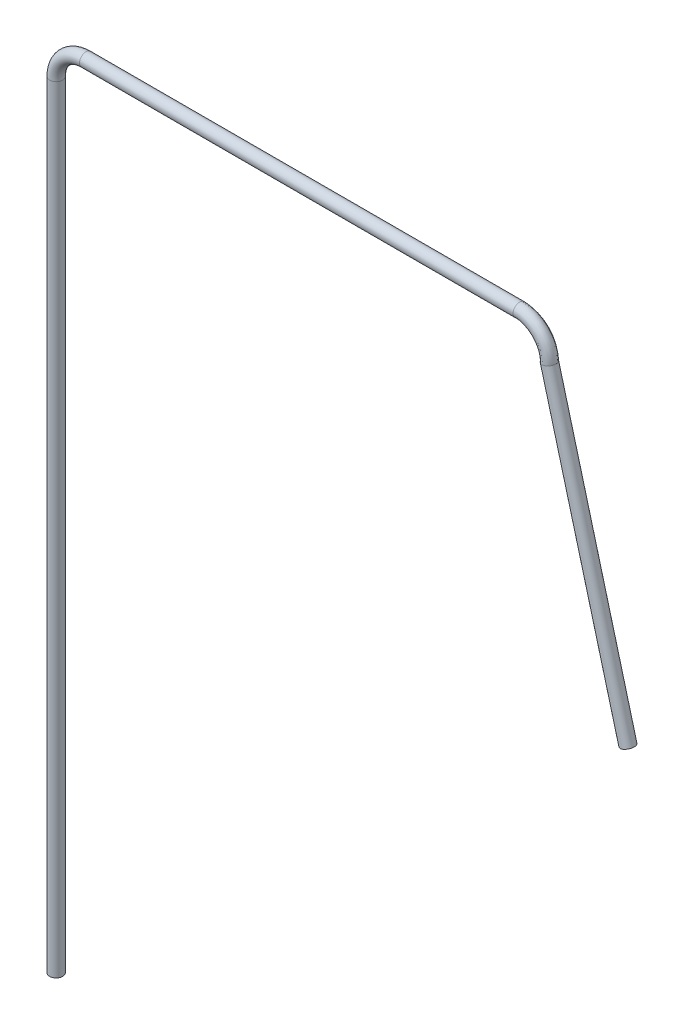
ISO-10303-21;
HEADER;
FILE_DESCRIPTION(('STEP AP214'),'2;1');
FILE_NAME('part.step','',(''),(''),'','','');
FILE_SCHEMA(('AUTOMOTIVE_DESIGN { 1 0 10303 214 1 1 1 1 }'));
ENDSEC;
DATA;
#1=APPLICATION_CONTEXT('core data for automotive mechanical design processes');
#2=APPLICATION_PROTOCOL_DEFINITION('international standard','automotive_design',2000,#1);
#3=PRODUCT_CONTEXT('',#1,'mechanical');
#4=PRODUCT('Part','Part','',(#3));
#5=PRODUCT_RELATED_PRODUCT_CATEGORY('part','',(#4));
#6=PRODUCT_DEFINITION_FORMATION('','',#4);
#7=PRODUCT_DEFINITION_CONTEXT('part definition',#1,'design');
#8=PRODUCT_DEFINITION('design','',#6,#7);
#9=PRODUCT_DEFINITION_SHAPE('','',#8);
#10=(LENGTH_UNIT() NAMED_UNIT(*) SI_UNIT(.MILLI.,.METRE.));
#11=(NAMED_UNIT(*) PLANE_ANGLE_UNIT() SI_UNIT($,.RADIAN.));
#12=(NAMED_UNIT(*) SI_UNIT($,.STERADIAN.) SOLID_ANGLE_UNIT());
#13=UNCERTAINTY_MEASURE_WITH_UNIT(LENGTH_MEASURE(1.E-05),#10,'distance_accuracy_value','');
#14=(GEOMETRIC_REPRESENTATION_CONTEXT(3) GLOBAL_UNCERTAINTY_ASSIGNED_CONTEXT((#13)) GLOBAL_UNIT_ASSIGNED_CONTEXT((#10,
#11,#12)) REPRESENTATION_CONTEXT('',''));
#15=CARTESIAN_POINT('',(0.,0.,0.));
#16=DIRECTION('',(0.,0.,1.));
#17=DIRECTION('',(1.,0.,0.));
#18=AXIS2_PLACEMENT_3D('',#15,#16,#17);
#19=CARTESIAN_POINT('',(71.0623231269298,-110.019219140882,0.));
#20=DIRECTION('',(-0.258819045102518,0.965925826289069,0.));
#21=DIRECTION('',(-0.965925826289069,-0.258819045102518,0.));
#22=AXIS2_PLACEMENT_3D('',#19,#20,#21);
#23=PLANE('',#22);
#24=CARTESIAN_POINT('',(71.0623231269298,-110.019219140882,0.));
#25=DIRECTION('',(-0.258819045102518,0.965925826289069,0.));
#26=DIRECTION('',(-0.965925826289069,-0.258819045102518,0.));
#27=AXIS2_PLACEMENT_3D('',#24,#25,#26);
#28=CIRCLE('',#27,3.81);
#29=CARTESIAN_POINT('',(67.3821457287685,-111.005319702722,0.));
#30=VERTEX_POINT('',#29);
#31=EDGE_CURVE('E60',#30,#30,#28,.T.);
#32=ORIENTED_EDGE('',*,*,#31,.F.);
#33=EDGE_LOOP('',(#32));
#34=FACE_BOUND('',#33,.T.);
#35=ADVANCED_FACE('F57',(#34),#23,.F.);
#36=CARTESIAN_POINT('',(-263.880572628289,-392.8701058306,0.));
#37=DIRECTION('',(0.,-1.,0.));
#38=DIRECTION('',(1.,0.,0.));
#39=AXIS2_PLACEMENT_3D('',#36,#37,#38);
#40=PLANE('',#39);
#41=CARTESIAN_POINT('',(-263.880572628289,-392.8701058306,0.));
#42=DIRECTION('',(0.,-1.,0.));
#43=DIRECTION('',(1.,0.,0.));
#44=AXIS2_PLACEMENT_3D('',#41,#42,#43);
#45=CIRCLE('',#44,3.81);
#46=CARTESIAN_POINT('',(-260.070572628289,-392.8701058306,0.));
#47=VERTEX_POINT('',#46);
#48=EDGE_CURVE('E134',#47,#47,#45,.T.);
#49=ORIENTED_EDGE('',*,*,#48,.T.);
#50=EDGE_LOOP('',(#49));
#51=FACE_BOUND('',#50,.T.);
#52=ADVANCED_FACE('F103',(#51),#40,.T.);
#53=CARTESIAN_POINT('',(24.8734767757891,62.35990218457,0.));
#54=DIRECTION('',(0.258819045102518,-0.965925826289069,0.));
#55=DIRECTION('',(0.965925826289069,0.258819045102518,0.));
#56=AXIS2_PLACEMENT_3D('',#53,#54,#55);
#57=CYLINDRICAL_SURFACE('',#56,3.81);
#58=CARTESIAN_POINT('',(25.0442969077021,61.7223927733147,-3.81000000000001));
#59=CARTESIAN_POINT('',(25.0522610892445,61.7234256772541,-3.81000003232664));
#60=CARTESIAN_POINT('',(25.0602255142462,61.724458985088,-3.80997508181354));
#61=CARTESIAN_POINT('',(25.1757193333071,61.7394485959842,-3.8092510848454));
#62=CARTESIAN_POINT('',(25.283260393004,61.7534738492406,-3.80402430168937));
#63=CARTESIAN_POINT('',(25.4975397663905,61.781554400173,-3.78449126548577));
#64=CARTESIAN_POINT('',(25.604277636522,61.7956097096297,-3.77018032179651));
#65=CARTESIAN_POINT('',(25.8164107398512,61.8236715487577,-3.73252114986992));
#66=CARTESIAN_POINT('',(25.9218025690519,61.8376779071298,-3.70915343848997));
#67=CARTESIAN_POINT('',(26.1302982509642,61.865504373381,-3.65353260963023));
#68=CARTESIAN_POINT('',(26.2334002790882,61.8793243295125,-3.62127266294687));
#69=CARTESIAN_POINT('',(26.5377169170544,61.9202743649971,-3.51158540434899));
#70=CARTESIAN_POINT('',(26.7344704732571,61.9469646573121,-3.4211564041722));
#71=CARTESIAN_POINT('',(27.109980123835,61.9982235349587,-3.20805164393777));
#72=CARTESIAN_POINT('',(27.2887361527676,62.0227921125754,-3.08537576663012));
#73=CARTESIAN_POINT('',(27.5390054763454,62.0573657333831,-2.88023072351548));
#74=CARTESIAN_POINT('',(27.6193345239919,62.0684940866937,-2.80846142230658));
#75=CARTESIAN_POINT('',(27.7736167717109,62.089918859367,-2.65836386191284));
#76=CARTESIAN_POINT('',(27.847576036798,62.1002160695056,-2.58004198509613));
#77=CARTESIAN_POINT('',(27.988667970607,62.1199028749767,-2.4173006642552));
#78=CARTESIAN_POINT('',(28.0557974074128,62.1292920405139,-2.33287836549267));
#79=CARTESIAN_POINT('',(28.1827017468923,62.1470766122553,-2.15858141604659));
#80=CARTESIAN_POINT('',(28.2424749936853,62.1554717946975,-2.06870554453513));
#81=CARTESIAN_POINT('',(28.4091678856227,62.1789245000401,-1.79329477469068));
#82=CARTESIAN_POINT('',(28.5047014310135,62.1924227387294,-1.60054177329632));
#83=CARTESIAN_POINT('',(28.6620696108415,62.2147072204423,-1.20160935562392));
#84=CARTESIAN_POINT('',(28.7239062398843,62.2234937423638,-0.995430734851183));
#85=CARTESIAN_POINT('',(28.8118602755316,62.2360023125349,-0.576773834235255));
#86=CARTESIAN_POINT('',(28.8382002672828,62.2397559194141,-0.364343427597758));
#87=CARTESIAN_POINT('',(28.8550853426785,62.2421616270996,0.0619550483770847));
#88=CARTESIAN_POINT('',(28.8456311641643,62.2408138330634,0.275823087989143));
#89=CARTESIAN_POINT('',(28.7912919084127,62.2330768351317,0.698304177726123));
#90=CARTESIAN_POINT('',(28.7465061850734,62.2267017681747,0.906930273472131));
#91=CARTESIAN_POINT('',(28.6229357515052,62.2091619185618,1.31364520872172));
#92=CARTESIAN_POINT('',(28.5441505634795,62.1979970685947,1.51173390009845));
#93=CARTESIAN_POINT('',(28.3547301602318,62.1712561854106,1.89209754634442));
#94=CARTESIAN_POINT('',(28.2440466590232,62.1556734652399,2.07434797760268));
#95=CARTESIAN_POINT('',(27.9940914569152,62.120644591131,2.41760765420608));
#96=CARTESIAN_POINT('',(27.854821811761,62.1011987150113,2.57861842561406));
#97=CARTESIAN_POINT('',(27.5508901102288,62.0589863851773,2.87576405303329));
#98=CARTESIAN_POINT('',(27.3861012450869,62.036203381195,3.01176682486794));
#99=CARTESIAN_POINT('',(27.036259900127,61.9881338264271,3.25422588031956));
#100=CARTESIAN_POINT('',(26.8511967743179,61.9628459610159,3.36066653620014));
#101=CARTESIAN_POINT('',(26.4631389398238,61.9102035688489,3.54244943311996));
#102=CARTESIAN_POINT('',(26.2599124419926,61.882823262024,3.6172888285367));
#103=CARTESIAN_POINT('',(25.8441605810055,61.8272978729213,3.73133359574699));
#104=CARTESIAN_POINT('',(25.6316546707728,61.7991544333721,3.77061008398302));
#105=CARTESIAN_POINT('',(25.301401269251,61.7558399598797,3.8031169568371));
#106=CARTESIAN_POINT('',(25.1848008632981,61.7406272437023,3.80919466993822));
#107=CARTESIAN_POINT('',(25.0602256374236,61.724459002313,3.80997504589845));
#108=CARTESIAN_POINT('',(25.0522612224854,61.7234256958681,3.80999999377994));
#109=CARTESIAN_POINT('',(25.0442969077022,61.7223927733147,3.81000000000002));
#110=B_SPLINE_CURVE_WITH_KNOTS('',3,(#58,#59,#60,#61,#62,#63,#64,#65,#66,#67,#68,#69,#70,#71,
#72,#73,#74,#75,#76,#77,#78,#79,#80,#81,#82,#83,#84,#85,#86,#87,#88,#89,#90,#91,#92,#93,#94,#95,
#96,#97,#98,#99,#100,#101,#102,#103,#104,#105,#106,#107,#108,#109),.UNSPECIFIED.,.F.,.F.,(4,2,2,
2,2,2,2,2,2,2,2,2,2,2,2,2,2,2,2,2,2,2,2,2,2,4),(0.,0.0240934641165133,0.349381619056047,
0.674837874584058,1.00099818086418,1.32740967833142,1.97862953794051,2.62985176542493,
2.95440531349319,3.27864633902993,3.60304009065623,3.92750673037878,4.57079851689915,
5.21405222121502,5.85325327363142,6.49244114998217,7.12983798059547,7.76724376888412,
8.40561954258933,9.04394942418581,9.68555955461699,10.3275082234317,10.9793183719465,
11.629822174579,11.9825884214082,12.0066818855246),.UNSPECIFIED.);
#111=CARTESIAN_POINT('',(25.0442969077021,61.7223927733147,-3.81000000000001));
#112=VERTEX_POINT('',#111);
#113=CARTESIAN_POINT('',(25.0442969077022,61.7223927733147,3.81000000000002));
#114=VERTEX_POINT('',#113);
#115=EDGE_CURVE('E12',#112,#114,#110,.T.);
#116=ORIENTED_EDGE('',*,*,#115,.T.);
#117=CARTESIAN_POINT('',(25.0442969077021,61.7223927733147,-3.81000000000001));
#118=CARTESIAN_POINT('',(25.0363327264286,61.721359866624,-3.81000003235124));
#119=CARTESIAN_POINT('',(25.0283682541992,61.7203269233725,-3.80997508183942));
#120=CARTESIAN_POINT('',(24.9127400803449,61.7053306744375,-3.80925026418607));
#121=CARTESIAN_POINT('',(24.8050560298701,61.6913649397425,-3.80401155443228));
#122=CARTESIAN_POINT('',(24.5904756072124,61.6635359604959,-3.78443704539123));
#123=CARTESIAN_POINT('',(24.4835796724225,61.6496727728441,-3.770096530351));
#124=CARTESIAN_POINT('',(24.271116515564,61.6221189507925,-3.73236464895332));
#125=CARTESIAN_POINT('',(24.1655526820179,61.6084287563543,-3.70895370048204));
#126=CARTESIAN_POINT('',(23.9567023780307,61.5813438505018,-3.65323621267798));
#127=CARTESIAN_POINT('',(23.8534177231237,61.5679493746453,-3.62092283988673));
#128=CARTESIAN_POINT('',(23.5485488140832,61.528412519852,-3.51106684362944));
#129=CARTESIAN_POINT('',(23.3514125179599,61.5028470597253,-3.42051245946873));
#130=CARTESIAN_POINT('',(22.9751224564378,61.4540479763851,-3.20713481890143));
#131=CARTESIAN_POINT('',(22.7959687452355,61.4308143601994,-3.08431146524556));
#132=CARTESIAN_POINT('',(22.545075879436,61.3982769720337,-2.87889179252105));
#133=CARTESIAN_POINT('',(22.4645182760787,61.3878297029875,-2.8070032290296));
#134=CARTESIAN_POINT('',(22.3097934245056,61.3677639297892,-2.65665265485124));
#135=CARTESIAN_POINT('',(22.2356201015075,61.3581446377987,-2.57819703630003));
#136=CARTESIAN_POINT('',(22.0941205596136,61.339794026924,-2.41517339372336));
#137=CARTESIAN_POINT('',(22.026797571764,61.3310631270611,-2.33060251723425));
#138=CARTESIAN_POINT('',(21.8995334619595,61.3145586588861,-2.15599391846767));
#139=CARTESIAN_POINT('',(21.8395939956958,61.3067853052957,-2.06595497675725));
#140=CARTESIAN_POINT('',(21.6725467821382,61.2851214974803,-1.79018601908183));
#141=CARTESIAN_POINT('',(21.5768502268174,61.2727109231344,-1.59723287693224));
#142=CARTESIAN_POINT('',(21.4192901880472,61.2522774754593,-1.1978838536004));
#143=CARTESIAN_POINT('',(21.357424378063,61.2442543004094,-0.991488897902151));
#144=CARTESIAN_POINT('',(21.2696479950462,61.2328708676393,-0.572716346056106));
#145=CARTESIAN_POINT('',(21.2434616849175,61.2294748504751,-0.360397721930146));
#146=CARTESIAN_POINT('',(21.2269591367699,61.227334688821,0.0656428657135534));
#147=CARTESIAN_POINT('',(21.2366419494798,61.2285904212232,0.279364791943674));
#148=CARTESIAN_POINT('',(21.2914758088164,61.2357016455912,0.70132460751499));
#149=CARTESIAN_POINT('',(21.3364958833912,61.2415401522187,0.909579818762629));
#150=CARTESIAN_POINT('',(21.4605038417665,61.2576223398648,1.31553644608803));
#151=CARTESIAN_POINT('',(21.5394920781412,61.2678660666075,1.51323775259707));
#152=CARTESIAN_POINT('',(21.7293003133841,61.2924816775292,1.89293645145279));
#153=CARTESIAN_POINT('',(21.840184441935,61.3068618784775,2.07490123567826));
#154=CARTESIAN_POINT('',(22.0904746254766,61.3393211960421,2.41762762390216));
#155=CARTESIAN_POINT('',(22.22987976529,61.3574001939721,2.57838990797061));
#156=CARTESIAN_POINT('',(22.5355785370459,61.3970452704564,2.87665041099459));
#157=CARTESIAN_POINT('',(22.7022562104419,61.4186611540908,3.01374845971418));
#158=CARTESIAN_POINT('',(23.0561515657832,61.464556271045,3.2578512328218));
#159=CARTESIAN_POINT('',(23.2433798012265,61.4888368727985,3.3648403936905));
#160=CARTESIAN_POINT('',(23.6330188832418,61.5393670028053,3.54578149221586));
#161=CARTESIAN_POINT('',(23.8354377198198,61.5656175672265,3.61971589935066));
#162=CARTESIAN_POINT('',(24.2493345800092,61.6192940616695,3.73237084099432));
#163=CARTESIAN_POINT('',(24.460793381242,61.646717497772,3.77116254820783));
#164=CARTESIAN_POINT('',(24.7890375807776,61.6892874800265,3.80321368730399));
#165=CARTESIAN_POINT('',(24.9047202322482,61.7042905506727,3.80920050452579));
#166=CARTESIAN_POINT('',(25.0283681283649,61.7203269070846,3.80997504573709));
#167=CARTESIAN_POINT('',(25.0363325904652,61.7213598490075,3.80999999360427));
#168=CARTESIAN_POINT('',(25.0442969077022,61.7223927733147,3.81000000000002));
#169=B_SPLINE_CURVE_WITH_KNOTS('',3,(#117,#118,#119,#120,#121,#122,#123,#124,#125,#126,#127,
#128,#129,#130,#131,#132,#133,#134,#135,#136,#137,#138,#139,#140,#141,#142,#143,#144,#145,#146,
#147,#148,#149,#150,#151,#152,#153,#154,#155,#156,#157,#158,#159,#160,#161,#162,#163,#164,#165,
#166,#167,#168),.UNSPECIFIED.,.F.,.F.,(4,2,2,2,2,2,2,2,2,2,2,2,2,2,2,2,2,2,2,2,2,2,2,2,2,4),(0.,
0.0240934640886435,0.349783891254068,0.675643200384809,1.00220996116639,1.329028094823,
1.98103535717274,2.63304458450506,2.95813985303888,3.28292228544114,3.60785720229516,
3.93286485087753,4.57670440732124,5.22049968145523,5.85929082796992,6.4980650690876,
7.13448290858094,7.77090735396403,8.40862044301737,9.04631307245117,9.69391147206811,
10.341844008059,10.990119767312,11.6370796526737,11.9870362501277,12.0111297142163),.UNSPECIFIED.);
#170=EDGE_CURVE('E66',#112,#114,#169,.T.);
#171=ORIENTED_EDGE('',*,*,#170,.F.);
#172=EDGE_LOOP('',(#116,#171));
#173=FACE_BOUND('',#172,.T.);
#174=ORIENTED_EDGE('',*,*,#31,.T.);
#175=EDGE_LOOP('',(#174));
#176=FACE_BOUND('',#175,.T.);
#177=ADVANCED_FACE('F76',(#173,#176),#57,.T.);
#178=CARTESIAN_POINT('',(-263.880572628289,-392.8701058306,0.));
#179=DIRECTION('',(0.,1.,0.));
#180=DIRECTION('',(-1.,0.,0.));
#181=AXIS2_PLACEMENT_3D('',#178,#179,#180);
#182=CYLINDRICAL_SURFACE('',#181,3.81);
#183=CARTESIAN_POINT('',(-263.880572628289,61.7898941694,0.));
#184=DIRECTION('',(0.,-1.,0.));
#185=DIRECTION('',(1.,0.,0.));
#186=AXIS2_PLACEMENT_3D('',#183,#184,#185);
#187=CIRCLE('',#186,3.81);
#188=CARTESIAN_POINT('',(-267.690572628289,61.7898941694,0.));
#189=VERTEX_POINT('',#188);
#190=EDGE_CURVE('E132',#189,#189,#187,.T.);
#191=ORIENTED_EDGE('',*,*,#190,.T.);
#192=EDGE_LOOP('',(#191));
#193=FACE_BOUND('',#192,.T.);
#194=ORIENTED_EDGE('',*,*,#48,.F.);
#195=EDGE_LOOP('',(#194));
#196=FACE_BOUND('',#195,.T.);
#197=ADVANCED_FACE('F102',(#193,#196),#182,.T.);
#198=CARTESIAN_POINT('',(-246.418072628289,61.7898941694,0.));
#199=DIRECTION('',(0.,0.,-1.));
#200=DIRECTION('',(-1.,0.,0.));
#201=AXIS2_PLACEMENT_3D('',#198,#199,#200);
#202=TOROIDAL_SURFACE('',#201,17.4625,3.81);
#203=CARTESIAN_POINT('',(-246.418072628289,79.2523941694,0.));
#204=DIRECTION('',(-1.,0.,0.));
#205=DIRECTION('',(0.,-1.,0.));
#206=AXIS2_PLACEMENT_3D('',#203,#204,#205);
#207=CIRCLE('',#206,3.81);
#208=CARTESIAN_POINT('',(-246.418072628289,83.0623941694,0.));
#209=VERTEX_POINT('',#208);
#210=EDGE_CURVE('E82',#209,#209,#207,.T.);
#211=CARTESIAN_POINT('',(-246.418072628289,61.7898941694,0.));
#212=DIRECTION('',(0.,0.,-1.));
#213=DIRECTION('',(-1.,0.,0.));
#214=AXIS2_PLACEMENT_3D('',#211,#212,#213);
#215=CIRCLE('',#214,21.2725);
#216=EDGE_CURVE('',#189,#209,#215,.T.);
#217=ORIENTED_EDGE('',*,*,#190,.F.);
#218=ORIENTED_EDGE('',*,*,#210,.T.);
#219=ORIENTED_EDGE('',*,*,#216,.T.);
#220=ORIENTED_EDGE('',*,*,#216,.F.);
#221=EDGE_LOOP('',(#217,#219,#218,#220));
#222=FACE_BOUND('',#221,.T.);
#223=ADVANCED_FACE('F116',(#222),#202,.T.);
#224=CARTESIAN_POINT('',(-246.418072628289,79.2523941694,0.));
#225=DIRECTION('',(1.,0.,0.));
#226=DIRECTION('',(0.,0.,-1.));
#227=AXIS2_PLACEMENT_3D('',#224,#225,#226);
#228=CYLINDRICAL_SURFACE('',#227,3.81);
#229=CARTESIAN_POINT('',(7.58192737171053,79.2523941694,0.));
#230=DIRECTION('',(-1.,0.,0.));
#231=DIRECTION('',(0.,-1.,0.));
#232=AXIS2_PLACEMENT_3D('',#229,#230,#231);
#233=CIRCLE('',#232,3.81);
#234=CARTESIAN_POINT('',(7.58192737171053,75.4423941694,0.));
#235=VERTEX_POINT('',#234);
#236=EDGE_CURVE('E79',#235,#235,#233,.T.);
#237=ORIENTED_EDGE('',*,*,#236,.T.);
#238=EDGE_LOOP('',(#237));
#239=FACE_BOUND('',#238,.T.);
#240=ORIENTED_EDGE('',*,*,#210,.F.);
#241=EDGE_LOOP('',(#240));
#242=FACE_BOUND('',#241,.T.);
#243=ADVANCED_FACE('F112',(#239,#242),#228,.T.);
#244=CARTESIAN_POINT('',(7.58192737171053,75.4423941694,0.));
#245=CARTESIAN_POINT('',(7.70952008843604,75.4423941694,0.));
#246=CARTESIAN_POINT('',(7.80586287839259,75.4410166652065,0.));
#247=CARTESIAN_POINT('',(8.02972595766402,75.4355077112372,0.));
#248=CARTESIAN_POINT('',(8.1416226433168,75.4313762569763,0.));
#249=CARTESIAN_POINT('',(8.47711015711393,75.414854661158,0.));
#250=CARTESIAN_POINT('',(8.7004987761951,75.3983364628231,0.));
#251=CARTESIAN_POINT('',(9.36905647880218,75.3323280483428,0.));
#252=CARTESIAN_POINT('',(9.81261737064053,75.2663696631957,0.));
#253=CARTESIAN_POINT('',(11.130368271876,75.0035907321278,0.));
#254=CARTESIAN_POINT('',(11.9914635663542,74.7416940463105,0.));
#255=CARTESIAN_POINT('',(14.4731719183775,73.7109259144037,0.));
#256=CARTESIAN_POINT('',(15.9900079263216,72.6942249903688,0.));
#257=CARTESIAN_POINT('',(18.5186782100366,70.1557611517449,0.));
#258=CARTESIAN_POINT('',(19.5295082080001,68.6350063925323,0.));
#259=CARTESIAN_POINT('',(20.5506755683493,66.1493321718085,0.));
#260=CARTESIAN_POINT('',(20.8092189713966,65.2873063783181,0.));
#261=CARTESIAN_POINT('',(21.0669017982902,63.9686129918534,0.));
#262=CARTESIAN_POINT('',(21.1311494349964,63.5248121863161,0.));
#263=CARTESIAN_POINT('',(21.1945818438037,62.8559828957218,0.));
#264=CARTESIAN_POINT('',(21.210239625598,62.6325184467277,0.));
#265=CARTESIAN_POINT('',(21.2254680772717,62.2969364198676,0.));
#266=CARTESIAN_POINT('',(21.2291680571358,62.1850114367106,0.));
#267=CARTESIAN_POINT('',(21.2338131506226,61.9610977335293,0.));
#268=CARTESIAN_POINT('',(21.2348170694712,61.8647353447911,0.));
#269=CARTESIAN_POINT('',(21.2339477851901,61.6391213340298,0.));
#270=CARTESIAN_POINT('',(21.2334749634672,61.5171225581913,0.));
#271=CARTESIAN_POINT('',(21.2326245543579,61.2971247657432,0.));
#272=CARTESIAN_POINT('',(21.232199349803,61.1871258695234,0.));
#273=CARTESIAN_POINT('',(21.2317741452483,61.0771269732932,0.));
#274=CARTESIAN_POINT('',(7.58192737171053,75.4423941694,7.62000000000001));
#275=CARTESIAN_POINT('',(7.70952008843604,75.4423941694,7.62000000000001));
#276=CARTESIAN_POINT('',(7.80586287839259,75.4410166652065,7.62000000000001));
#277=CARTESIAN_POINT('',(8.02972595766402,75.4355077112372,7.62000000000001));
#278=CARTESIAN_POINT('',(8.1416226433168,75.4313762569763,7.62000000000001));
#279=CARTESIAN_POINT('',(8.47711015711393,75.414854661158,7.62000000000001));
#280=CARTESIAN_POINT('',(8.7004987761951,75.3983364628231,7.62000000000001));
#281=CARTESIAN_POINT('',(9.36905647880218,75.3323280483428,7.62000000000001));
#282=CARTESIAN_POINT('',(9.81261737064053,75.2663696631957,7.62000000000001));
#283=CARTESIAN_POINT('',(11.130368271876,75.0035907321278,7.62000000000001));
#284=CARTESIAN_POINT('',(11.9914635663542,74.7416940463105,7.62000000000001));
#285=CARTESIAN_POINT('',(14.4731719183775,73.7109259144037,7.62000000000001));
#286=CARTESIAN_POINT('',(15.9900079263216,72.6942249903688,7.62000000000001));
#287=CARTESIAN_POINT('',(18.5186782100366,70.1557611517449,7.62000000000001));
#288=CARTESIAN_POINT('',(19.5295082080001,68.6350063925323,7.62000000000001));
#289=CARTESIAN_POINT('',(20.5506755683493,66.1493321718085,7.62000000000001));
#290=CARTESIAN_POINT('',(20.8092189713966,65.2873063783181,7.62000000000001));
#291=CARTESIAN_POINT('',(21.0669017982902,63.9686129918534,7.62000000000001));
#292=CARTESIAN_POINT('',(21.1311494349964,63.5248121863161,7.62000000000001));
#293=CARTESIAN_POINT('',(21.1945818438037,62.8559828957218,7.62000000000001));
#294=CARTESIAN_POINT('',(21.210239625598,62.6325184467277,7.62000000000001));
#295=CARTESIAN_POINT('',(21.2254680772717,62.2969364198676,7.62000000000001));
#296=CARTESIAN_POINT('',(21.2291680571358,62.1850114367106,7.62000000000001));
#297=CARTESIAN_POINT('',(21.2338131506226,61.9610977335293,7.62000000000001));
#298=CARTESIAN_POINT('',(21.2348170694712,61.8647353447911,7.62000000000001));
#299=CARTESIAN_POINT('',(21.2339477851901,61.6391213340298,7.62000000000001));
#300=CARTESIAN_POINT('',(21.2334749634672,61.5171225581913,7.62000000000001));
#301=CARTESIAN_POINT('',(21.2326245543579,61.2971247657432,7.62000000000001));
#302=CARTESIAN_POINT('',(21.232199349803,61.1871258695234,7.62000000000001));
#303=CARTESIAN_POINT('',(21.2317741452483,61.0771269732932,7.62000000000001));
#304=CARTESIAN_POINT('',(7.58192737171054,83.0623941694001,7.62000000000001));
#305=CARTESIAN_POINT('',(7.74076728436884,83.0623941694001,7.62000000000001));
#306=CARTESIAN_POINT('',(7.9308501379371,83.0602478256584,7.62000000000001));
#307=CARTESIAN_POINT('',(8.2796600521486,83.0516641066794,7.62000000000001));
#308=CARTESIAN_POINT('',(8.45401070188789,83.0452267244629,7.62000000000001));
#309=CARTESIAN_POINT('',(8.97674706059463,83.0194837728327,7.62000000000001));
#310=CARTESIAN_POINT('',(9.3248176996227,82.9937461149629,7.62000000000001));
#311=CARTESIAN_POINT('',(10.3665238874227,82.8908957947362,7.62000000000001));
#312=CARTESIAN_POINT('',(11.0576536491161,82.788123427169,7.62000000000001));
#313=CARTESIAN_POINT('',(13.1108934254509,82.3786771857546,7.62000000000001));
#314=CARTESIAN_POINT('',(14.4526000471025,81.9706056055435,7.62000000000001));
#315=CARTESIAN_POINT('',(18.3194479443902,80.3645250278398,7.62000000000001));
#316=CARTESIAN_POINT('',(20.6828900963216,78.7803631229892,7.62000000000001));
#317=CARTESIAN_POINT('',(24.6229112360946,74.8250822581833,7.62000000000001));
#318=CARTESIAN_POINT('',(26.1979254189812,72.4555341449631,7.62000000000001));
#319=CARTESIAN_POINT('',(27.789046654831,68.5825068708347,7.62000000000001));
#320=CARTESIAN_POINT('',(28.1918933526084,67.2393504018875,7.62000000000001));
#321=CARTESIAN_POINT('',(28.5933991526644,65.1846421020663,7.62000000000001));
#322=CARTESIAN_POINT('',(28.6935059354403,64.4931385213417,7.62000000000001));
#323=CARTESIAN_POINT('',(28.792342479388,63.4510091615745,7.62000000000001));
#324=CARTESIAN_POINT('',(28.8167394882333,63.1028203689602,7.62000000000001));
#325=CARTESIAN_POINT('',(28.8404675408405,62.5799367457083,7.62000000000001));
#326=CARTESIAN_POINT('',(28.8462326257453,62.405542004511,7.62000000000001));
#327=CARTESIAN_POINT('',(28.8534703295501,62.0566532111836,7.62000000000001));
#328=CARTESIAN_POINT('',(28.8548800530686,61.8665328417525,7.62000000000001));
#329=CARTESIAN_POINT('',(28.8537987707285,61.5856664202128,7.62000000000001));
#330=CARTESIAN_POINT('',(28.8534180337181,61.4876674035359,7.62000000000001));
#331=CARTESIAN_POINT('',(28.8525676246087,61.2676696110878,7.62000000000001));
#332=CARTESIAN_POINT('',(28.8521424200539,61.157670714868,7.62000000000001));
#333=CARTESIAN_POINT('',(28.8517172154992,61.0476718186379,7.62000000000001));
#334=CARTESIAN_POINT('',(7.58192737171054,83.0623941694001,0.));
#335=CARTESIAN_POINT('',(7.74076728436884,83.0623941694001,0.));
#336=CARTESIAN_POINT('',(7.9308501379371,83.0602478256584,0.));
#337=CARTESIAN_POINT('',(8.2796600521486,83.0516641066794,0.));
#338=CARTESIAN_POINT('',(8.45401070188789,83.0452267244629,0.));
#339=CARTESIAN_POINT('',(8.97674706059463,83.0194837728327,0.));
#340=CARTESIAN_POINT('',(9.3248176996227,82.9937461149629,0.));
#341=CARTESIAN_POINT('',(10.3665238874227,82.8908957947362,0.));
#342=CARTESIAN_POINT('',(11.0576536491161,82.788123427169,0.));
#343=CARTESIAN_POINT('',(13.1108934254509,82.3786771857546,0.));
#344=CARTESIAN_POINT('',(14.4526000471025,81.9706056055435,0.));
#345=CARTESIAN_POINT('',(18.3194479443902,80.3645250278398,0.));
#346=CARTESIAN_POINT('',(20.6828900963216,78.7803631229892,0.));
#347=CARTESIAN_POINT('',(24.6229112360946,74.8250822581833,0.));
#348=CARTESIAN_POINT('',(26.1979254189812,72.4555341449631,0.));
#349=CARTESIAN_POINT('',(27.789046654831,68.5825068708347,0.));
#350=CARTESIAN_POINT('',(28.1918933526084,67.2393504018875,0.));
#351=CARTESIAN_POINT('',(28.5933991526644,65.1846421020663,0.));
#352=CARTESIAN_POINT('',(28.6935059354403,64.4931385213417,0.));
#353=CARTESIAN_POINT('',(28.792342479388,63.4510091615745,0.));
#354=CARTESIAN_POINT('',(28.8167394882333,63.1028203689602,0.));
#355=CARTESIAN_POINT('',(28.8404675408405,62.5799367457083,0.));
#356=CARTESIAN_POINT('',(28.8462326257453,62.405542004511,0.));
#357=CARTESIAN_POINT('',(28.8534703295501,62.0566532111836,0.));
#358=CARTESIAN_POINT('',(28.8548800530686,61.8665328417525,0.));
#359=CARTESIAN_POINT('',(28.8537987707285,61.5856664202128,0.));
#360=CARTESIAN_POINT('',(28.8534180337181,61.4876674035359,0.));
#361=CARTESIAN_POINT('',(28.8525676246087,61.2676696110878,0.));
#362=CARTESIAN_POINT('',(28.8521424200539,61.157670714868,0.));
#363=CARTESIAN_POINT('',(28.8517172154992,61.0476718186379,0.));
#364=CARTESIAN_POINT('',(7.58192737171054,83.0623941694001,-7.62000000000001));
#365=CARTESIAN_POINT('',(7.74076728436884,83.0623941694001,-7.62000000000001));
#366=CARTESIAN_POINT('',(7.9308501379371,83.0602478256584,-7.62000000000001));
#367=CARTESIAN_POINT('',(8.2796600521486,83.0516641066794,-7.62000000000001));
#368=CARTESIAN_POINT('',(8.45401070188789,83.0452267244629,-7.62000000000001));
#369=CARTESIAN_POINT('',(8.97674706059463,83.0194837728327,-7.62000000000001));
#370=CARTESIAN_POINT('',(9.3248176996227,82.9937461149629,-7.62000000000001));
#371=CARTESIAN_POINT('',(10.3665238874227,82.8908957947362,-7.62000000000001));
#372=CARTESIAN_POINT('',(11.0576536491161,82.788123427169,-7.62000000000001));
#373=CARTESIAN_POINT('',(13.1108934254509,82.3786771857546,-7.62000000000001));
#374=CARTESIAN_POINT('',(14.4526000471025,81.9706056055435,-7.62000000000001));
#375=CARTESIAN_POINT('',(18.3194479443902,80.3645250278398,-7.62000000000001));
#376=CARTESIAN_POINT('',(20.6828900963216,78.7803631229892,-7.62000000000001));
#377=CARTESIAN_POINT('',(24.6229112360946,74.8250822581833,-7.62000000000001));
#378=CARTESIAN_POINT('',(26.1979254189812,72.4555341449631,-7.62000000000001));
#379=CARTESIAN_POINT('',(27.789046654831,68.5825068708347,-7.62000000000001));
#380=CARTESIAN_POINT('',(28.1918933526084,67.2393504018875,-7.62000000000001));
#381=CARTESIAN_POINT('',(28.5933991526644,65.1846421020663,-7.62000000000001));
#382=CARTESIAN_POINT('',(28.6935059354403,64.4931385213417,-7.62000000000001));
#383=CARTESIAN_POINT('',(28.792342479388,63.4510091615745,-7.62000000000001));
#384=CARTESIAN_POINT('',(28.8167394882333,63.1028203689602,-7.62000000000001));
#385=CARTESIAN_POINT('',(28.8404675408405,62.5799367457083,-7.62000000000001));
#386=CARTESIAN_POINT('',(28.8462326257453,62.405542004511,-7.62000000000001));
#387=CARTESIAN_POINT('',(28.8534703295501,62.0566532111836,-7.62000000000001));
#388=CARTESIAN_POINT('',(28.8548800530686,61.8665328417525,-7.62000000000001));
#389=CARTESIAN_POINT('',(28.8537987707285,61.5856664202128,-7.62000000000001));
#390=CARTESIAN_POINT('',(28.8534180337181,61.4876674035359,-7.62000000000001));
#391=CARTESIAN_POINT('',(28.8525676246087,61.2676696110878,-7.62000000000001));
#392=CARTESIAN_POINT('',(28.8521424200539,61.157670714868,-7.62000000000001));
#393=CARTESIAN_POINT('',(28.8517172154992,61.0476718186379,-7.62000000000001));
#394=CARTESIAN_POINT('',(7.58192737171053,75.4423941694,-7.62000000000001));
#395=CARTESIAN_POINT('',(7.70952008843604,75.4423941694,-7.62000000000001));
#396=CARTESIAN_POINT('',(7.80586287839259,75.4410166652065,-7.62000000000001));
#397=CARTESIAN_POINT('',(8.02972595766402,75.4355077112372,-7.62000000000001));
#398=CARTESIAN_POINT('',(8.1416226433168,75.4313762569763,-7.62000000000001));
#399=CARTESIAN_POINT('',(8.47711015711393,75.414854661158,-7.62000000000001));
#400=CARTESIAN_POINT('',(8.7004987761951,75.3983364628231,-7.62000000000001));
#401=CARTESIAN_POINT('',(9.36905647880218,75.3323280483428,-7.62000000000001));
#402=CARTESIAN_POINT('',(9.81261737064053,75.2663696631957,-7.62000000000001));
#403=CARTESIAN_POINT('',(11.130368271876,75.0035907321278,-7.62000000000001));
#404=CARTESIAN_POINT('',(11.9914635663542,74.7416940463105,-7.62000000000001));
#405=CARTESIAN_POINT('',(14.4731719183775,73.7109259144037,-7.62000000000001));
#406=CARTESIAN_POINT('',(15.9900079263216,72.6942249903688,-7.62000000000001));
#407=CARTESIAN_POINT('',(18.5186782100366,70.1557611517449,-7.62000000000001));
#408=CARTESIAN_POINT('',(19.5295082080001,68.6350063925323,-7.62000000000001));
#409=CARTESIAN_POINT('',(20.5506755683493,66.1493321718085,-7.62000000000001));
#410=CARTESIAN_POINT('',(20.8092189713966,65.2873063783181,-7.62000000000001));
#411=CARTESIAN_POINT('',(21.0669017982902,63.9686129918534,-7.62000000000001));
#412=CARTESIAN_POINT('',(21.1311494349964,63.5248121863161,-7.62000000000001));
#413=CARTESIAN_POINT('',(21.1945818438037,62.8559828957218,-7.62000000000001));
#414=CARTESIAN_POINT('',(21.210239625598,62.6325184467277,-7.62000000000001));
#415=CARTESIAN_POINT('',(21.2254680772717,62.2969364198676,-7.62000000000001));
#416=CARTESIAN_POINT('',(21.2291680571358,62.1850114367106,-7.62000000000001));
#417=CARTESIAN_POINT('',(21.2338131506226,61.9610977335293,-7.62000000000001));
#418=CARTESIAN_POINT('',(21.2348170694712,61.8647353447911,-7.62000000000001));
#419=CARTESIAN_POINT('',(21.2339477851901,61.6391213340298,-7.62000000000001));
#420=CARTESIAN_POINT('',(21.2334749634672,61.5171225581913,-7.62000000000001));
#421=CARTESIAN_POINT('',(21.2326245543579,61.2971247657432,-7.62000000000001));
#422=CARTESIAN_POINT('',(21.232199349803,61.1871258695234,-7.62000000000001));
#423=CARTESIAN_POINT('',(21.2317741452483,61.0771269732932,-7.62000000000001));
#424=CARTESIAN_POINT('',(7.58192737171053,75.4423941694,0.));
#425=CARTESIAN_POINT('',(7.70952008843604,75.4423941694,0.));
#426=CARTESIAN_POINT('',(7.80586287839259,75.4410166652065,0.));
#427=CARTESIAN_POINT('',(8.02972595766402,75.4355077112372,0.));
#428=CARTESIAN_POINT('',(8.1416226433168,75.4313762569763,0.));
#429=CARTESIAN_POINT('',(8.47711015711393,75.414854661158,0.));
#430=CARTESIAN_POINT('',(8.7004987761951,75.3983364628231,0.));
#431=CARTESIAN_POINT('',(9.36905647880218,75.3323280483428,0.));
#432=CARTESIAN_POINT('',(9.81261737064053,75.2663696631957,0.));
#433=CARTESIAN_POINT('',(11.130368271876,75.0035907321278,0.));
#434=CARTESIAN_POINT('',(11.9914635663542,74.7416940463105,0.));
#435=CARTESIAN_POINT('',(14.4731719183775,73.7109259144037,0.));
#436=CARTESIAN_POINT('',(15.9900079263216,72.6942249903688,0.));
#437=CARTESIAN_POINT('',(18.5186782100366,70.1557611517449,0.));
#438=CARTESIAN_POINT('',(19.5295082080001,68.6350063925323,0.));
#439=CARTESIAN_POINT('',(20.5506755683493,66.1493321718085,0.));
#440=CARTESIAN_POINT('',(20.8092189713966,65.2873063783181,0.));
#441=CARTESIAN_POINT('',(21.0669017982902,63.9686129918534,0.));
#442=CARTESIAN_POINT('',(21.1311494349964,63.5248121863161,0.));
#443=CARTESIAN_POINT('',(21.1945818438037,62.8559828957218,0.));
#444=CARTESIAN_POINT('',(21.210239625598,62.6325184467277,0.));
#445=CARTESIAN_POINT('',(21.2254680772717,62.2969364198676,0.));
#446=CARTESIAN_POINT('',(21.2291680571358,62.1850114367106,0.));
#447=CARTESIAN_POINT('',(21.2338131506226,61.9610977335293,0.));
#448=CARTESIAN_POINT('',(21.2348170694712,61.8647353447911,0.));
#449=CARTESIAN_POINT('',(21.2339477851901,61.6391213340298,0.));
#450=CARTESIAN_POINT('',(21.2334749634672,61.5171225581913,0.));
#451=CARTESIAN_POINT('',(21.2326245543579,61.2971247657432,0.));
#452=CARTESIAN_POINT('',(21.232199349803,61.1871258695234,0.));
#453=CARTESIAN_POINT('',(21.2317741452483,61.0771269732932,0.));
#454=(BOUNDED_SURFACE() B_SPLINE_SURFACE(3,3,((#244,#245,#246,#247,#248,#249,#250,#251,#252,
#253,#254,#255,#256,#257,#258,#259,#260,#261,#262,#263,#264,#265,#266,#267,#268,#269,#270,#271,
#272,#273),(#274,#275,#276,#277,#278,#279,#280,#281,#282,#283,#284,#285,#286,#287,#288,#289,
#290,#291,#292,#293,#294,#295,#296,#297,#298,#299,#300,#301,#302,#303),(#304,#305,#306,#307,
#308,#309,#310,#311,#312,#313,#314,#315,#316,#317,#318,#319,#320,#321,#322,#323,#324,#325,#326,
#327,#328,#329,#330,#331,#332,#333),(#334,#335,#336,#337,#338,#339,#340,#341,#342,#343,#344,
#345,#346,#347,#348,#349,#350,#351,#352,#353,#354,#355,#356,#357,#358,#359,#360,#361,#362,#363),
(#364,#365,#366,#367,#368,#369,#370,#371,#372,#373,#374,#375,#376,#377,#378,#379,#380,#381,#382,
#383,#384,#385,#386,#387,#388,#389,#390,#391,#392,#393),(#394,#395,#396,#397,#398,#399,#400,
#401,#402,#403,#404,#405,#406,#407,#408,#409,#410,#411,#412,#413,#414,#415,#416,#417,#418,#419,
#420,#421,#422,#423),(#424,#425,#426,#427,#428,#429,#430,#431,#432,#433,#434,#435,#436,#437,
#438,#439,#440,#441,#442,#443,#444,#445,#446,#447,#448,#449,#450,#451,#452,#453)),.UNSPECIFIED.,
.T.,.F.,.F.) B_SPLINE_SURFACE_WITH_KNOTS((4,3,4),(4,2,2,2,2,2,2,2,2,2,2,2,2,2,4),(0.,0.5,1.),
(0.963989025302064,0.964551696781719,0.965114368261374,0.966239711220685,0.968490397139306,
0.972991768976548,0.981994512651032,0.990997256325516,0.995498628162758,0.997749314081379,
0.998874657040689,0.999437328520345,1.,1.00043209069632,1.00086418139263),
.UNSPECIFIED.) GEOMETRIC_REPRESENTATION_ITEM() RATIONAL_B_SPLINE_SURFACE(((1.,1.,1.,1.,1.,1.,1.,
1.,1.,1.,1.,1.,1.,1.,1.,1.,1.,1.,1.,1.,1.,1.,1.,1.,1.,1.,1.,1.,1.,1.),(0.333333333333333,
0.333333333333333,0.333333333333333,0.333333333333333,0.333333333333333,0.333333333333333,
0.333333333333333,0.333333333333333,0.333333333333333,0.333333333333333,0.333333333333333,
0.333333333333333,0.333333333333333,0.333333333333333,0.333333333333333,0.333333333333333,
0.333333333333333,0.333333333333333,0.333333333333333,0.333333333333333,0.333333333333333,
0.333333333333333,0.333333333333333,0.333333333333333,0.333333333333333,0.333333333333333,
0.333333333333333,0.333333333333333,0.333333333333333,0.333333333333333),(0.333333333333333,
0.333333333333333,0.333333333333333,0.333333333333333,0.333333333333333,0.333333333333333,
0.333333333333333,0.333333333333333,0.333333333333333,0.333333333333333,0.333333333333333,
0.333333333333333,0.333333333333333,0.333333333333333,0.333333333333333,0.333333333333333,
0.333333333333333,0.333333333333333,0.333333333333333,0.333333333333333,0.333333333333333,
0.333333333333333,0.333333333333333,0.333333333333333,0.333333333333333,0.333333333333333,
0.333333333333333,0.333333333333333,0.333333333333333,0.333333333333333),(1.,1.,1.,1.,1.,1.,1.,
1.,1.,1.,1.,1.,1.,1.,1.,1.,1.,1.,1.,1.,1.,1.,1.,1.,1.,1.,1.,1.,1.,1.),(0.333333333333333,
0.333333333333333,0.333333333333333,0.333333333333333,0.333333333333333,0.333333333333333,
0.333333333333333,0.333333333333333,0.333333333333333,0.333333333333333,0.333333333333333,
0.333333333333333,0.333333333333333,0.333333333333333,0.333333333333333,0.333333333333333,
0.333333333333333,0.333333333333333,0.333333333333333,0.333333333333333,0.333333333333333,
0.333333333333333,0.333333333333333,0.333333333333333,0.333333333333333,0.333333333333333,
0.333333333333333,0.333333333333333,0.333333333333333,0.333333333333333),(0.333333333333333,
0.333333333333333,0.333333333333333,0.333333333333333,0.333333333333333,0.333333333333333,
0.333333333333333,0.333333333333333,0.333333333333333,0.333333333333333,0.333333333333333,
0.333333333333333,0.333333333333333,0.333333333333333,0.333333333333333,0.333333333333333,
0.333333333333333,0.333333333333333,0.333333333333333,0.333333333333333,0.333333333333333,
0.333333333333333,0.333333333333333,0.333333333333333,0.333333333333333,0.333333333333333,
0.333333333333333,0.333333333333333,0.333333333333333,0.333333333333333),(1.,1.,1.,1.,1.,1.,1.,
1.,1.,1.,1.,1.,1.,1.,1.,1.,1.,1.,1.,1.,1.,1.,1.,1.,1.,1.,1.,1.,1.,1.))) REPRESENTATION_ITEM('') SURFACE());
#455=ORIENTED_EDGE('',*,*,#170,.T.);
#456=ORIENTED_EDGE('',*,*,#115,.F.);
#457=EDGE_LOOP('',(#455,#456));
#458=FACE_BOUND('',#457,.T.);
#459=ORIENTED_EDGE('',*,*,#236,.F.);
#460=EDGE_LOOP('',(#459));
#461=FACE_BOUND('',#460,.T.);
#462=ADVANCED_FACE('F73',(#458,#461),#454,.F.);
#463=CLOSED_SHELL('',(#35,#52,#177,#197,#223,#243,#462));
#464=MANIFOLD_SOLID_BREP('B2',#463);
#465=ADVANCED_BREP_SHAPE_REPRESENTATION('',(#18,#464),#14);
#466=SHAPE_DEFINITION_REPRESENTATION(#9,#465);
ENDSEC;
END-ISO-10303-21;
